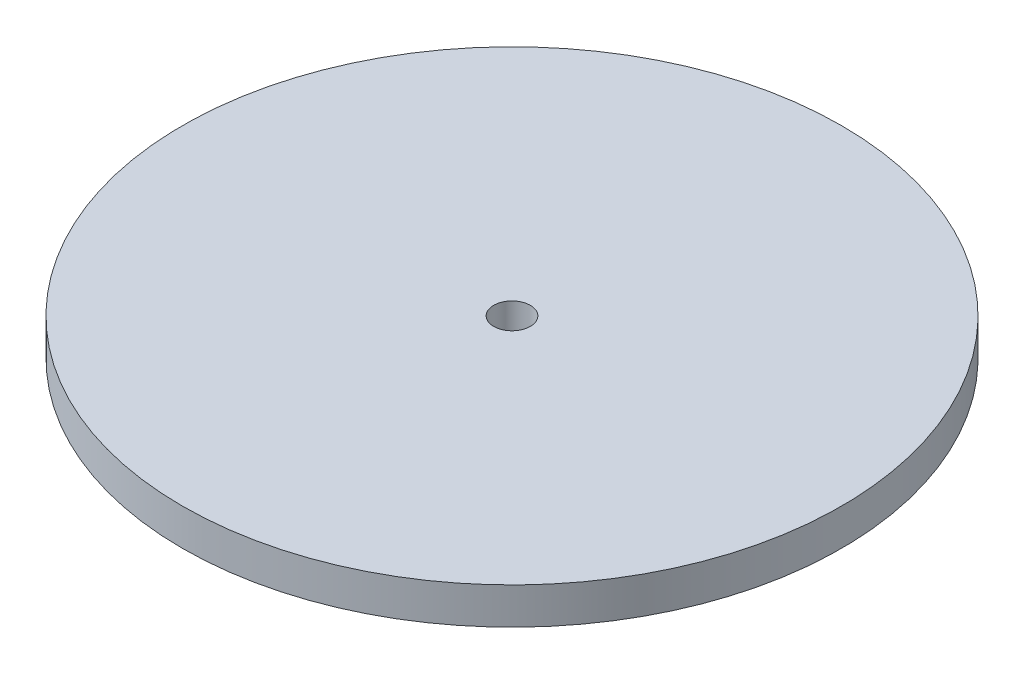
ISO-10303-21;
HEADER;
FILE_DESCRIPTION(('STEP AP214'),'2;1');
FILE_NAME('part.step','',(''),(''),'','','');
FILE_SCHEMA(('AUTOMOTIVE_DESIGN { 1 0 10303 214 1 1 1 1 }'));
ENDSEC;
DATA;
#1=APPLICATION_CONTEXT('core data for automotive mechanical design processes');
#2=APPLICATION_PROTOCOL_DEFINITION('international standard','automotive_design',2000,#1);
#3=PRODUCT_CONTEXT('',#1,'mechanical');
#4=PRODUCT('Part','Part','',(#3));
#5=PRODUCT_RELATED_PRODUCT_CATEGORY('part','',(#4));
#6=PRODUCT_DEFINITION_FORMATION('','',#4);
#7=PRODUCT_DEFINITION_CONTEXT('part definition',#1,'design');
#8=PRODUCT_DEFINITION('design','',#6,#7);
#9=PRODUCT_DEFINITION_SHAPE('','',#8);
#10=(LENGTH_UNIT() NAMED_UNIT(*) SI_UNIT(.MILLI.,.METRE.));
#11=(NAMED_UNIT(*) PLANE_ANGLE_UNIT() SI_UNIT($,.RADIAN.));
#12=(NAMED_UNIT(*) SI_UNIT($,.STERADIAN.) SOLID_ANGLE_UNIT());
#13=UNCERTAINTY_MEASURE_WITH_UNIT(LENGTH_MEASURE(1.E-05),#10,'distance_accuracy_value','');
#14=(GEOMETRIC_REPRESENTATION_CONTEXT(3) GLOBAL_UNCERTAINTY_ASSIGNED_CONTEXT((#13)) GLOBAL_UNIT_ASSIGNED_CONTEXT((#10,
#11,#12)) REPRESENTATION_CONTEXT('',''));
#15=CARTESIAN_POINT('',(0.,0.,0.));
#16=DIRECTION('',(0.,0.,1.));
#17=DIRECTION('',(1.,0.,0.));
#18=AXIS2_PLACEMENT_3D('',#15,#16,#17);
#19=CARTESIAN_POINT('',(0.,10.,0.));
#20=DIRECTION('',(0.,-1.,0.));
#21=DIRECTION('',(0.,0.,-1.));
#22=AXIS2_PLACEMENT_3D('',#19,#20,#21);
#23=CYLINDRICAL_SURFACE('',#22,90.);
#24=CARTESIAN_POINT('',(0.,10.,0.));
#25=DIRECTION('',(0.,1.,0.));
#26=DIRECTION('',(0.,0.,1.));
#27=AXIS2_PLACEMENT_3D('',#24,#25,#26);
#28=CIRCLE('',#27,90.);
#29=CARTESIAN_POINT('',(0.,10.,90.));
#30=VERTEX_POINT('',#29);
#31=EDGE_CURVE('E10',#30,#30,#28,.T.);
#32=ORIENTED_EDGE('',*,*,#31,.F.);
#33=EDGE_LOOP('',(#32));
#34=FACE_BOUND('',#33,.T.);
#35=CARTESIAN_POINT('',(0.,0.,0.));
#36=DIRECTION('',(0.,1.,0.));
#37=DIRECTION('',(0.,0.,1.));
#38=AXIS2_PLACEMENT_3D('',#35,#36,#37);
#39=CIRCLE('',#38,90.);
#40=CARTESIAN_POINT('',(0.,0.,90.));
#41=VERTEX_POINT('',#40);
#42=EDGE_CURVE('E44',#41,#41,#39,.T.);
#43=ORIENTED_EDGE('',*,*,#42,.T.);
#44=EDGE_LOOP('',(#43));
#45=FACE_BOUND('',#44,.T.);
#46=ADVANCED_FACE('F41',(#34,#45),#23,.T.);
#47=CARTESIAN_POINT('',(0.,10.,0.));
#48=DIRECTION('',(0.,1.,0.));
#49=DIRECTION('',(0.,0.,1.));
#50=AXIS2_PLACEMENT_3D('',#47,#48,#49);
#51=PLANE('',#50);
#52=CARTESIAN_POINT('',(0.,10.,0.));
#53=DIRECTION('',(0.,1.,0.));
#54=DIRECTION('',(0.,0.,1.));
#55=AXIS2_PLACEMENT_3D('',#52,#53,#54);
#56=CIRCLE('',#55,5.);
#57=CARTESIAN_POINT('',(0.,10.,5.));
#58=VERTEX_POINT('',#57);
#59=EDGE_CURVE('E55',#58,#58,#56,.T.);
#60=ORIENTED_EDGE('',*,*,#59,.F.);
#61=EDGE_LOOP('',(#60));
#62=FACE_BOUND('',#61,.T.);
#63=ORIENTED_EDGE('',*,*,#31,.T.);
#64=EDGE_LOOP('',(#63));
#65=FACE_BOUND('',#64,.T.);
#66=ADVANCED_FACE('F72',(#62,#65),#51,.T.);
#67=CARTESIAN_POINT('',(0.,0.,0.));
#68=DIRECTION('',(0.,1.,0.));
#69=DIRECTION('',(0.,0.,1.));
#70=AXIS2_PLACEMENT_3D('',#67,#68,#69);
#71=PLANE('',#70);
#72=CARTESIAN_POINT('',(0.,0.,0.));
#73=DIRECTION('',(0.,1.,0.));
#74=DIRECTION('',(0.,0.,1.));
#75=AXIS2_PLACEMENT_3D('',#72,#73,#74);
#76=CIRCLE('',#75,5.);
#77=CARTESIAN_POINT('',(0.,0.,5.));
#78=VERTEX_POINT('',#77);
#79=EDGE_CURVE('E53',#78,#78,#76,.T.);
#80=ORIENTED_EDGE('',*,*,#79,.T.);
#81=EDGE_LOOP('',(#80));
#82=FACE_BOUND('',#81,.T.);
#83=ORIENTED_EDGE('',*,*,#42,.F.);
#84=EDGE_LOOP('',(#83));
#85=FACE_BOUND('',#84,.T.);
#86=ADVANCED_FACE('F63',(#82,#85),#71,.F.);
#87=CARTESIAN_POINT('',(0.,0.,0.));
#88=DIRECTION('',(0.,1.,0.));
#89=DIRECTION('',(0.,0.,1.));
#90=AXIS2_PLACEMENT_3D('',#87,#88,#89);
#91=CYLINDRICAL_SURFACE('',#90,5.);
#92=ORIENTED_EDGE('',*,*,#79,.F.);
#93=EDGE_LOOP('',(#92));
#94=FACE_BOUND('',#93,.T.);
#95=ORIENTED_EDGE('',*,*,#59,.T.);
#96=EDGE_LOOP('',(#95));
#97=FACE_BOUND('',#96,.T.);
#98=ADVANCED_FACE('F66',(#94,#97),#91,.F.);
#99=CLOSED_SHELL('',(#46,#66,#86,#98));
#100=MANIFOLD_SOLID_BREP('B2',#99);
#101=ADVANCED_BREP_SHAPE_REPRESENTATION('',(#18,#100),#14);
#102=SHAPE_DEFINITION_REPRESENTATION(#9,#101);
ENDSEC;
END-ISO-10303-21;
